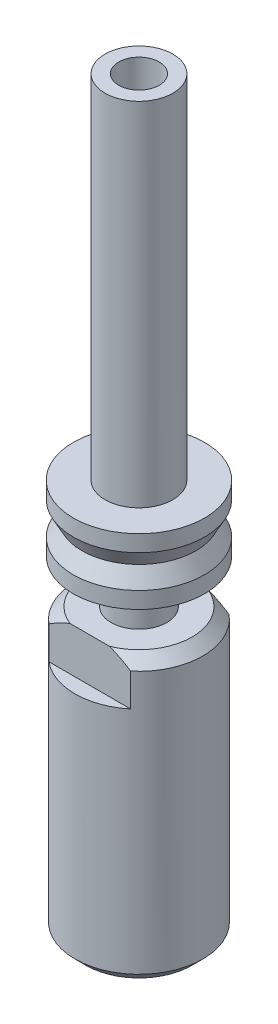
ISO-10303-21;
HEADER;
FILE_DESCRIPTION(('STEP AP214'),'2;1');
FILE_NAME('part.step','',(''),(''),'','','');
FILE_SCHEMA(('AUTOMOTIVE_DESIGN { 1 0 10303 214 1 1 1 1 }'));
ENDSEC;
DATA;
#1=APPLICATION_CONTEXT('core data for automotive mechanical design processes');
#2=APPLICATION_PROTOCOL_DEFINITION('international standard','automotive_design',2000,#1);
#3=PRODUCT_CONTEXT('',#1,'mechanical');
#4=PRODUCT('Part','Part','',(#3));
#5=PRODUCT_RELATED_PRODUCT_CATEGORY('part','',(#4));
#6=PRODUCT_DEFINITION_FORMATION('','',#4);
#7=PRODUCT_DEFINITION_CONTEXT('part definition',#1,'design');
#8=PRODUCT_DEFINITION('design','',#6,#7);
#9=PRODUCT_DEFINITION_SHAPE('','',#8);
#10=(LENGTH_UNIT() NAMED_UNIT(*) SI_UNIT(.MILLI.,.METRE.));
#11=(NAMED_UNIT(*) PLANE_ANGLE_UNIT() SI_UNIT($,.RADIAN.));
#12=(NAMED_UNIT(*) SI_UNIT($,.STERADIAN.) SOLID_ANGLE_UNIT());
#13=UNCERTAINTY_MEASURE_WITH_UNIT(LENGTH_MEASURE(1.E-05),#10,'distance_accuracy_value','');
#14=(GEOMETRIC_REPRESENTATION_CONTEXT(3) GLOBAL_UNCERTAINTY_ASSIGNED_CONTEXT((#13)) GLOBAL_UNIT_ASSIGNED_CONTEXT((#10,
#11,#12)) REPRESENTATION_CONTEXT('',''));
#15=CARTESIAN_POINT('',(0.,0.,0.));
#16=DIRECTION('',(0.,0.,1.));
#17=DIRECTION('',(1.,0.,0.));
#18=AXIS2_PLACEMENT_3D('',#15,#16,#17);
#19=CARTESIAN_POINT('',(0.,-2.,0.));
#20=DIRECTION('',(0.,-1.,0.));
#21=DIRECTION('',(0.,0.,-1.));
#22=AXIS2_PLACEMENT_3D('',#19,#20,#21);
#23=CONICAL_SURFACE('',#22,2.42500000000001,0.785398163397442);
#24=CARTESIAN_POINT('',(-6.04269539904228,-6.02299718405701,-2.25));
#25=CARTESIAN_POINT('',(-5.85392315526963,-5.84614321216174,-2.25));
#26=CARTESIAN_POINT('',(-5.6646934150476,-5.66977020501488,-2.25));
#27=CARTESIAN_POINT('',(-5.28485419184243,-5.31841346895825,-2.25));
#28=CARTESIAN_POINT('',(-5.09424434802556,-5.14343013045018,-2.25));
#29=CARTESIAN_POINT('',(-4.70961644395453,-4.79386269475751,-2.25));
#30=CARTESIAN_POINT('',(-4.51558315950188,-4.61929531450541,-2.25));
#31=CARTESIAN_POINT('',(-4.12509424635204,-4.27294806277855,-2.25));
#32=CARTESIAN_POINT('',(-3.92863904955637,-4.10116770659282,-2.25));
#33=CARTESIAN_POINT('',(-3.5659038288083,-3.79056325138715,-2.25));
#34=CARTESIAN_POINT('',(-3.40017145575118,-3.65110095413692,-2.25));
#35=CARTESIAN_POINT('',(-3.06525482429823,-3.3761915318433,-2.25));
#36=CARTESIAN_POINT('',(-2.89606908421042,-3.24074619415351,-2.25));
#37=CARTESIAN_POINT('',(-2.63883692782491,-3.04242343026941,-2.25));
#38=CARTESIAN_POINT('',(-2.55260958941985,-2.97718931723904,-2.25));
#39=CARTESIAN_POINT('',(-2.37868638950739,-2.8487136204099,-2.25));
#40=CARTESIAN_POINT('',(-2.29099063101107,-2.78547189773246,-2.25));
#41=CARTESIAN_POINT('',(-2.11387321277794,-2.66157705236619,-2.25));
#42=CARTESIAN_POINT('',(-2.02445280237287,-2.60092215103976,-2.25));
#43=CARTESIAN_POINT('',(-1.84345344982441,-2.48293820931975,-2.25));
#44=CARTESIAN_POINT('',(-1.75187497247355,-2.42560846181495,-2.25));
#45=CARTESIAN_POINT('',(-1.58428754294718,-2.32615581314897,-2.25));
#46=CARTESIAN_POINT('',(-1.50874290524784,-2.28325398598045,-2.25));
#47=CARTESIAN_POINT('',(-1.35568339080589,-2.20106302782308,-2.25));
#48=CARTESIAN_POINT('',(-1.27816825399849,-2.16177437689107,-2.25));
#49=CARTESIAN_POINT('',(-1.12104869321378,-2.08785717351091,-2.25));
#50=CARTESIAN_POINT('',(-1.04144710379408,-2.05322265424139,-2.25));
#51=CARTESIAN_POINT('',(-0.879934056748406,-1.98980356260767,-2.25));
#52=CARTESIAN_POINT('',(-0.798023312656502,-1.96101720522948,-2.25));
#53=CARTESIAN_POINT('',(-0.649993812839143,-1.91618679919093,-2.25));
#54=CARTESIAN_POINT('',(-0.584304280608316,-1.89873320313058,-2.25));
#55=CARTESIAN_POINT('',(-0.451770338017659,-1.86899899049763,-2.25));
#56=CARTESIAN_POINT('',(-0.384926328163733,-1.85671661603839,-2.25));
#57=CARTESIAN_POINT('',(-0.250597741822877,-1.8379385713068,-2.25));
#58=CARTESIAN_POINT('',(-0.183115309241266,-1.83142778506157,-2.25));
#59=CARTESIAN_POINT('',(-0.0478348246194907,-1.82449475801551,-2.25));
#60=CARTESIAN_POINT('',(0.0199632193035873,-1.82407236148567,-2.25));
#61=CARTESIAN_POINT('',(0.155341125798874,-1.82934096753563,-2.25));
#62=CARTESIAN_POINT('',(0.222920904057496,-1.83503410168034,-2.25));
#63=CARTESIAN_POINT('',(0.35734054863803,-1.85222314823185,-2.25));
#64=CARTESIAN_POINT('',(0.424180259835302,-1.8637202545225,-2.25));
#65=CARTESIAN_POINT('',(0.556924437810713,-1.89198993657772,-2.25));
#66=CARTESIAN_POINT('',(0.62282559921783,-1.90877783657871,-2.25));
#67=CARTESIAN_POINT('',(0.753271784597098,-1.94692551243794,-2.25));
#68=CARTESIAN_POINT('',(0.817816800607222,-1.96828531512992,-2.25));
#69=CARTESIAN_POINT('',(1.03626006799508,-2.04796499856611,-2.25));
#70=CARTESIAN_POINT('',(1.18673773108654,-2.11565951897345,-2.25));
#71=CARTESIAN_POINT('',(1.48043014893859,-2.26538094087567,-2.25));
#72=CARTESIAN_POINT('',(1.62362776930288,-2.34743980239225,-2.25));
#73=CARTESIAN_POINT('',(1.90614793057827,-2.52176605447454,-2.25));
#74=CARTESIAN_POINT('',(2.04539693537268,-2.61415117796364,-2.25));
#75=CARTESIAN_POINT('',(2.31942486505248,-2.80495316555597,-2.25));
#76=CARTESIAN_POINT('',(2.45420823425165,-2.90336373700816,-2.25));
#77=CARTESIAN_POINT('',(2.74471632171505,-3.12257720030645,-2.25));
#78=CARTESIAN_POINT('',(2.89981294242657,-3.24420772190934,-2.25));
#79=CARTESIAN_POINT('',(3.20685524548438,-3.49139682555347,-2.25));
#80=CARTESIAN_POINT('',(3.3588004776749,-3.6169559624334,-2.25));
#81=CARTESIAN_POINT('',(3.66050538618995,-3.87094873984889,-2.25));
#82=CARTESIAN_POINT('',(3.81026287636862,-3.9993849687665,-2.25));
#83=CARTESIAN_POINT('',(4.10802999251105,-4.25826906265923,-2.25));
#84=CARTESIAN_POINT('',(4.25603957808739,-4.38871697395673,-2.25));
#85=CARTESIAN_POINT('',(4.54192824844072,-4.64329805248578,-2.25));
#86=CARTESIAN_POINT('',(4.67988516731278,-4.76734397305246,-2.25));
#87=CARTESIAN_POINT('',(4.95485588810548,-5.01648107744459,-2.25));
#88=CARTESIAN_POINT('',(5.09186967137797,-5.14157228183026,-2.25));
#89=CARTESIAN_POINT('',(5.36487462829817,-5.39234186781037,-2.25));
#90=CARTESIAN_POINT('',(5.5008672577876,-5.5180186662129,-2.25));
#91=CARTESIAN_POINT('',(5.77222080994753,-5.77004191105563,-2.25));
#92=CARTESIAN_POINT('',(5.90758175737126,-5.89638833083443,-2.25));
#93=CARTESIAN_POINT('',(6.04269539904228,-6.02299718405701,-2.25));
#94=B_SPLINE_CURVE_WITH_KNOTS('',3,(#24,#25,#26,#27,#28,#29,#30,#31,#32,#33,#34,#35,#36,#37,#38,
#39,#40,#41,#42,#43,#44,#45,#46,#47,#48,#49,#50,#51,#52,#53,#54,#55,#56,#57,#58,#59,#60,#61,#62,
#63,#64,#65,#66,#67,#68,#69,#70,#71,#72,#73,#74,#75,#76,#77,#78,#79,#80,#81,#82,#83,#84,#85,#86,
#87,#88,#89,#90,#91,#92,#93),.UNSPECIFIED.,.F.,.F.,(4,2,2,2,2,2,2,2,2,2,2,2,2,2,2,2,2,2,2,2,2,2,
2,2,2,2,2,2,2,2,2,2,2,2,4),(0.,0.776029170871052,1.5522691443434,2.33526219012724,
3.11811756791359,3.76789020183039,4.41794774290245,4.74229638334316,5.06662236496042,
5.39072162894112,5.71475171690835,5.97530599165908,6.23589483452713,6.49614633593064,
6.75631828193723,6.96004621934655,7.16370484618176,7.36682849514538,7.569946948598,
7.77313622185684,7.9763673084277,8.18019252802659,8.38401894396392,8.8776117455327,
9.37231706156619,9.87338563818224,10.3739395680678,10.965144845378,11.5564339989266,
12.1482783575828,12.7401363648611,13.2967046712393,13.853283950933,14.4087973761007,
14.9642888468615),.UNSPECIFIED.);
#95=CARTESIAN_POINT('',(-1.86899036915675,-2.50000000000003,-2.25));
#96=VERTEX_POINT('',#95);
#97=CARTESIAN_POINT('',(-0.90450262575631,-2.,-2.25));
#98=VERTEX_POINT('',#97);
#99=EDGE_CURVE('E45',#96,#98,#94,.T.);
#100=ORIENTED_EDGE('',*,*,#99,.F.);
#101=CARTESIAN_POINT('',(0.,-2.5,0.));
#102=DIRECTION('',(0.,-1.,0.));
#103=DIRECTION('',(0.,0.,-1.));
#104=AXIS2_PLACEMENT_3D('',#101,#102,#103);
#105=CIRCLE('',#104,2.925);
#106=CARTESIAN_POINT('',(-1.86899036915657,-2.5,2.25));
#107=VERTEX_POINT('',#106);
#108=EDGE_CURVE('E302',#107,#96,#105,.T.);
#109=ORIENTED_EDGE('',*,*,#108,.F.);
#110=CARTESIAN_POINT('',(6.04269539904228,-6.02299718405701,2.25));
#111=CARTESIAN_POINT('',(5.85392315526963,-5.84614321216174,2.25));
#112=CARTESIAN_POINT('',(5.6646934150476,-5.66977020501488,2.25));
#113=CARTESIAN_POINT('',(5.28485419184243,-5.31841346895825,2.25));
#114=CARTESIAN_POINT('',(5.09424434802556,-5.14343013045018,2.25));
#115=CARTESIAN_POINT('',(4.70961644395453,-4.79386269475751,2.25));
#116=CARTESIAN_POINT('',(4.51558315950188,-4.61929531450541,2.25));
#117=CARTESIAN_POINT('',(4.12509424635204,-4.27294806277855,2.25));
#118=CARTESIAN_POINT('',(3.92863904955637,-4.10116770659282,2.25));
#119=CARTESIAN_POINT('',(3.5659038288083,-3.79056325138715,2.25));
#120=CARTESIAN_POINT('',(3.40017145575118,-3.65110095413692,2.25));
#121=CARTESIAN_POINT('',(3.06525482429823,-3.3761915318433,2.25));
#122=CARTESIAN_POINT('',(2.89606908421042,-3.24074619415351,2.25));
#123=CARTESIAN_POINT('',(2.63883692782492,-3.04242343026941,2.25));
#124=CARTESIAN_POINT('',(2.55260958941985,-2.97718931723904,2.25));
#125=CARTESIAN_POINT('',(2.3786863895074,-2.8487136204099,2.25));
#126=CARTESIAN_POINT('',(2.29099063101107,-2.78547189773246,2.25));
#127=CARTESIAN_POINT('',(2.11387321277795,-2.6615770523662,2.25));
#128=CARTESIAN_POINT('',(2.02445280237287,-2.60092215103976,2.25));
#129=CARTESIAN_POINT('',(1.84345344982442,-2.48293820931976,2.25));
#130=CARTESIAN_POINT('',(1.75187497247355,-2.42560846181495,2.25));
#131=CARTESIAN_POINT('',(1.58428754294718,-2.32615581314897,2.25));
#132=CARTESIAN_POINT('',(1.50874290524785,-2.28325398598045,2.25));
#133=CARTESIAN_POINT('',(1.35568339080589,-2.20106302782308,2.25));
#134=CARTESIAN_POINT('',(1.27816825399849,-2.16177437689107,2.25));
#135=CARTESIAN_POINT('',(1.12104869321378,-2.08785717351091,2.25));
#136=CARTESIAN_POINT('',(1.04144710379408,-2.0532226542414,2.25));
#137=CARTESIAN_POINT('',(0.879934056748408,-1.98980356260767,2.25));
#138=CARTESIAN_POINT('',(0.798023312656504,-1.96101720522948,2.25));
#139=CARTESIAN_POINT('',(0.649993812839145,-1.91618679919093,2.25));
#140=CARTESIAN_POINT('',(0.584304280608318,-1.89873320313058,2.25));
#141=CARTESIAN_POINT('',(0.451770338017662,-1.86899899049763,2.25));
#142=CARTESIAN_POINT('',(0.384926328163736,-1.85671661603839,2.25));
#143=CARTESIAN_POINT('',(0.25059774182288,-1.8379385713068,2.25));
#144=CARTESIAN_POINT('',(0.183115309241269,-1.83142778506157,2.25));
#145=CARTESIAN_POINT('',(0.0478348246194936,-1.82449475801551,2.25));
#146=CARTESIAN_POINT('',(-0.0199632193035848,-1.82407236148567,2.25));
#147=CARTESIAN_POINT('',(-0.155341125798872,-1.82934096753563,2.25));
#148=CARTESIAN_POINT('',(-0.222920904057495,-1.83503410168034,2.25));
#149=CARTESIAN_POINT('',(-0.357340548638028,-1.85222314823185,2.25));
#150=CARTESIAN_POINT('',(-0.4241802598353,-1.8637202545225,2.25));
#151=CARTESIAN_POINT('',(-0.556924437810711,-1.89198993657772,2.25));
#152=CARTESIAN_POINT('',(-0.622825599217827,-1.90877783657871,2.25));
#153=CARTESIAN_POINT('',(-0.753271784597096,-1.94692551243794,2.25));
#154=CARTESIAN_POINT('',(-0.81781680060722,-1.96828531512992,2.25));
#155=CARTESIAN_POINT('',(-1.03626006799508,-2.04796499856611,2.25));
#156=CARTESIAN_POINT('',(-1.18673773108653,-2.11565951897345,2.25));
#157=CARTESIAN_POINT('',(-1.48043014893859,-2.26538094087566,2.25));
#158=CARTESIAN_POINT('',(-1.62362776930288,-2.34743980239224,2.25));
#159=CARTESIAN_POINT('',(-1.90614793057826,-2.52176605447454,2.25));
#160=CARTESIAN_POINT('',(-2.04539693537268,-2.61415117796364,2.25));
#161=CARTESIAN_POINT('',(-2.31942486505247,-2.80495316555596,2.25));
#162=CARTESIAN_POINT('',(-2.45420823425165,-2.90336373700815,2.25));
#163=CARTESIAN_POINT('',(-2.74471632171505,-3.12257720030645,2.25));
#164=CARTESIAN_POINT('',(-2.89981294242656,-3.24420772190933,2.25));
#165=CARTESIAN_POINT('',(-3.20685524548438,-3.49139682555347,2.25));
#166=CARTESIAN_POINT('',(-3.35880047767489,-3.61695596243339,2.25));
#167=CARTESIAN_POINT('',(-3.66050538618995,-3.87094873984888,2.25));
#168=CARTESIAN_POINT('',(-3.81026287636861,-3.99938496876649,2.25));
#169=CARTESIAN_POINT('',(-4.10802999251105,-4.25826906265923,2.25));
#170=CARTESIAN_POINT('',(-4.25603957808739,-4.38871697395673,2.25));
#171=CARTESIAN_POINT('',(-4.54192824844071,-4.64329805248577,2.25));
#172=CARTESIAN_POINT('',(-4.67988516731278,-4.76734397305246,2.25));
#173=CARTESIAN_POINT('',(-4.95485588810548,-5.01648107744459,2.25));
#174=CARTESIAN_POINT('',(-5.09186967137797,-5.14157228183026,2.25));
#175=CARTESIAN_POINT('',(-5.36487462829817,-5.39234186781037,2.25));
#176=CARTESIAN_POINT('',(-5.5008672577876,-5.5180186662129,2.25));
#177=CARTESIAN_POINT('',(-5.77222080994753,-5.77004191105563,2.25));
#178=CARTESIAN_POINT('',(-5.90758175737126,-5.89638833083443,2.25));
#179=CARTESIAN_POINT('',(-6.04269539904228,-6.02299718405701,2.25));
#180=B_SPLINE_CURVE_WITH_KNOTS('',3,(#110,#111,#112,#113,#114,#115,#116,#117,#118,#119,#120,
#121,#122,#123,#124,#125,#126,#127,#128,#129,#130,#131,#132,#133,#134,#135,#136,#137,#138,#139,
#140,#141,#142,#143,#144,#145,#146,#147,#148,#149,#150,#151,#152,#153,#154,#155,#156,#157,#158,
#159,#160,#161,#162,#163,#164,#165,#166,#167,#168,#169,#170,#171,#172,#173,#174,#175,#176,#177,
#178,#179),.UNSPECIFIED.,.F.,.F.,(4,2,2,2,2,2,2,2,2,2,2,2,2,2,2,2,2,2,2,2,2,2,2,2,2,2,2,2,2,2,2,
2,2,2,4),(0.,0.776029170871053,1.5522691443434,2.33526219012724,3.11811756791359,
3.76789020183039,4.41794774290245,4.74229638334315,5.06662236496042,5.39072162894112,
5.71475171690834,5.97530599165908,6.23589483452712,6.49614633593064,6.75631828193722,
6.96004621934654,7.16370484618176,7.36682849514538,7.569946948598,7.77313622185684,
7.9763673084277,8.18019252802659,8.38401894396391,8.87761174553269,9.37231706156618,
9.87338563818223,10.3739395680678,10.965144845378,11.5564339989266,12.1482783575828,
12.7401363648611,13.2967046712393,13.853283950933,14.4087973761007,14.9642888468615),.UNSPECIFIED.);
#181=CARTESIAN_POINT('',(-0.90450262575631,-2.,2.25));
#182=VERTEX_POINT('',#181);
#183=EDGE_CURVE('E107',#182,#107,#180,.T.);
#184=ORIENTED_EDGE('',*,*,#183,.F.);
#185=CARTESIAN_POINT('',(0.,-2.,0.));
#186=DIRECTION('',(0.,-1.,0.));
#187=DIRECTION('',(0.,0.,-1.));
#188=AXIS2_PLACEMENT_3D('',#185,#186,#187);
#189=CIRCLE('',#188,2.42500000000001);
#190=EDGE_CURVE('E59',#98,#182,#189,.F.);
#191=ORIENTED_EDGE('',*,*,#190,.F.);
#192=EDGE_LOOP('',(#100,#109,#184,#191));
#193=FACE_BOUND('',#192,.T.);
#194=ADVANCED_FACE('F35',(#193),#23,.T.);
#195=CARTESIAN_POINT('',(0.,26.0943396226415,0.));
#196=DIRECTION('',(0.,1.,0.));
#197=DIRECTION('',(0.,0.,1.));
#198=AXIS2_PLACEMENT_3D('',#195,#196,#197);
#199=CYLINDRICAL_SURFACE('',#198,0.925000000000003);
#200=CARTESIAN_POINT('',(0.,19.1,0.));
#201=DIRECTION('',(0.,-1.,0.));
#202=DIRECTION('',(0.,0.,-1.));
#203=AXIS2_PLACEMENT_3D('',#200,#201,#202);
#204=CIRCLE('',#203,0.925000000000003);
#205=CARTESIAN_POINT('',(0.,19.1,-0.925000000000003));
#206=VERTEX_POINT('',#205);
#207=EDGE_CURVE('E104',#206,#206,#204,.F.);
#208=ORIENTED_EDGE('',*,*,#207,.T.);
#209=EDGE_LOOP('',(#208));
#210=FACE_BOUND('',#209,.T.);
#211=CARTESIAN_POINT('',(0.,-15.,0.));
#212=DIRECTION('',(0.,1.,0.));
#213=DIRECTION('',(0.,0.,1.));
#214=AXIS2_PLACEMENT_3D('',#211,#212,#213);
#215=CIRCLE('',#214,0.925000000000005);
#216=CARTESIAN_POINT('',(0.,-15.,0.925000000000005));
#217=VERTEX_POINT('',#216);
#218=EDGE_CURVE('E340',#217,#217,#215,.T.);
#219=ORIENTED_EDGE('',*,*,#218,.F.);
#220=EDGE_LOOP('',(#219));
#221=FACE_BOUND('',#220,.T.);
#222=ADVANCED_FACE('F177',(#210,#221),#199,.F.);
#223=CARTESIAN_POINT('',(0.,-15.,-0.925000000000005));
#224=DIRECTION('',(0.,1.,0.));
#225=DIRECTION('',(0.,0.,1.));
#226=AXIS2_PLACEMENT_3D('',#223,#224,#225);
#227=PLANE('',#226);
#228=CARTESIAN_POINT('',(0.,-15.,0.));
#229=DIRECTION('',(0.,1.,0.));
#230=DIRECTION('',(0.,0.,1.));
#231=AXIS2_PLACEMENT_3D('',#228,#229,#230);
#232=CIRCLE('',#231,2.425);
#233=CARTESIAN_POINT('',(0.,-15.,2.425));
#234=VERTEX_POINT('',#233);
#235=EDGE_CURVE('E108',#234,#234,#232,.F.);
#236=ORIENTED_EDGE('',*,*,#235,.T.);
#237=EDGE_LOOP('',(#236));
#238=FACE_BOUND('',#237,.T.);
#239=ORIENTED_EDGE('',*,*,#218,.T.);
#240=EDGE_LOOP('',(#239));
#241=FACE_BOUND('',#240,.T.);
#242=ADVANCED_FACE('F173',(#238,#241),#227,.F.);
#243=CARTESIAN_POINT('',(0.,26.0943396226415,0.));
#244=DIRECTION('',(0.,1.,0.));
#245=DIRECTION('',(0.,0.,1.));
#246=AXIS2_PLACEMENT_3D('',#243,#244,#245);
#247=CYLINDRICAL_SURFACE('',#246,2.925);
#248=CARTESIAN_POINT('',(0.,-14.5,0.));
#249=DIRECTION('',(0.,1.,0.));
#250=DIRECTION('',(0.,0.,1.));
#251=AXIS2_PLACEMENT_3D('',#248,#249,#250);
#252=CIRCLE('',#251,2.925);
#253=CARTESIAN_POINT('',(0.,-14.5,2.925));
#254=VERTEX_POINT('',#253);
#255=EDGE_CURVE('E111',#254,#254,#252,.T.);
#256=ORIENTED_EDGE('',*,*,#255,.T.);
#257=EDGE_LOOP('',(#256));
#258=FACE_BOUND('',#257,.T.);
#259=CARTESIAN_POINT('',(0.,-4.,0.));
#260=DIRECTION('',(0.,-1.,0.));
#261=DIRECTION('',(0.,0.,-1.));
#262=AXIS2_PLACEMENT_3D('',#259,#260,#261);
#263=CIRCLE('',#262,2.925);
#264=CARTESIAN_POINT('',(-1.86899036915656,-4.,-2.25));
#265=VERTEX_POINT('',#264);
#266=CARTESIAN_POINT('',(1.86899036915656,-4.,-2.25));
#267=VERTEX_POINT('',#266);
#268=EDGE_CURVE('E11',#265,#267,#263,.T.);
#269=ORIENTED_EDGE('',*,*,#268,.T.);
#270=DIRECTION('',(0.,1.,0.));
#271=VECTOR('',#270,1.);
#272=CARTESIAN_POINT('',(1.86899036915656,26.0943396226415,-2.25000000000001));
#273=LINE('',#272,#271);
#274=CARTESIAN_POINT('',(1.86899036915657,-2.5,-2.25));
#275=VERTEX_POINT('',#274);
#276=EDGE_CURVE('E296',#267,#275,#273,.T.);
#277=ORIENTED_EDGE('',*,*,#276,.T.);
#278=CARTESIAN_POINT('',(1.86899036915675,-2.50000000000003,2.25));
#279=VERTEX_POINT('',#278);
#280=EDGE_CURVE('E343',#275,#279,#105,.T.);
#281=ORIENTED_EDGE('',*,*,#280,.T.);
#282=DIRECTION('',(0.,1.,0.));
#283=VECTOR('',#282,1.);
#284=CARTESIAN_POINT('',(1.86899036915656,26.0943396226415,2.25000000000001));
#285=LINE('',#284,#283);
#286=CARTESIAN_POINT('',(1.86899036915658,-4.,2.25));
#287=VERTEX_POINT('',#286);
#288=EDGE_CURVE('E313',#279,#287,#285,.F.);
#289=ORIENTED_EDGE('',*,*,#288,.T.);
#290=CARTESIAN_POINT('',(0.,-4.,0.));
#291=DIRECTION('',(0.,-1.,0.));
#292=DIRECTION('',(0.,0.,-1.));
#293=AXIS2_PLACEMENT_3D('',#290,#291,#292);
#294=CIRCLE('',#293,2.925);
#295=CARTESIAN_POINT('',(-1.86899036915658,-4.,2.25));
#296=VERTEX_POINT('',#295);
#297=EDGE_CURVE('E121',#287,#296,#294,.T.);
#298=ORIENTED_EDGE('',*,*,#297,.T.);
#299=DIRECTION('',(0.,1.,0.));
#300=VECTOR('',#299,1.);
#301=CARTESIAN_POINT('',(-1.86899036915656,26.0943396226415,2.25000000000001));
#302=LINE('',#301,#300);
#303=EDGE_CURVE('E310',#296,#107,#302,.T.);
#304=ORIENTED_EDGE('',*,*,#303,.T.);
#305=ORIENTED_EDGE('',*,*,#108,.T.);
#306=DIRECTION('',(0.,1.,0.));
#307=VECTOR('',#306,1.);
#308=CARTESIAN_POINT('',(-1.86899036915656,26.0943396226415,-2.25000000000001));
#309=LINE('',#308,#307);
#310=EDGE_CURVE('E92',#96,#265,#309,.F.);
#311=ORIENTED_EDGE('',*,*,#310,.T.);
#312=EDGE_LOOP('',(#269,#277,#281,#289,#298,#304,#305,#311));
#313=FACE_BOUND('',#312,.T.);
#314=ADVANCED_FACE('F170',(#258,#313),#247,.T.);
#315=CARTESIAN_POINT('',(0.,-2.,-2.925));
#316=DIRECTION('',(0.,-1.,0.));
#317=DIRECTION('',(0.,0.,-1.));
#318=AXIS2_PLACEMENT_3D('',#315,#316,#317);
#319=PLANE('',#318);
#320=CARTESIAN_POINT('',(0.90450262575631,-2.,2.25));
#321=VERTEX_POINT('',#320);
#322=CARTESIAN_POINT('',(0.90450262575631,-2.,-2.25));
#323=VERTEX_POINT('',#322);
#324=EDGE_CURVE('E102',#321,#323,#189,.F.);
#325=ORIENTED_EDGE('',*,*,#324,.T.);
#326=DIRECTION('',(1.,0.,0.));
#327=VECTOR('',#326,1.);
#328=CARTESIAN_POINT('',(-3.,-2.,-2.25));
#329=LINE('',#328,#327);
#330=EDGE_CURVE('E52',#98,#323,#329,.T.);
#331=ORIENTED_EDGE('',*,*,#330,.F.);
#332=ORIENTED_EDGE('',*,*,#190,.T.);
#333=DIRECTION('',(1.,0.,0.));
#334=VECTOR('',#333,1.);
#335=CARTESIAN_POINT('',(-3.,-2.,2.25));
#336=LINE('',#335,#334);
#337=EDGE_CURVE('E306',#182,#321,#336,.T.);
#338=ORIENTED_EDGE('',*,*,#337,.T.);
#339=EDGE_LOOP('',(#325,#331,#332,#338));
#340=FACE_BOUND('',#339,.T.);
#341=CARTESIAN_POINT('',(0.,-2.,0.));
#342=DIRECTION('',(0.,1.,0.));
#343=DIRECTION('',(0.,0.,1.));
#344=AXIS2_PLACEMENT_3D('',#341,#342,#343);
#345=CIRCLE('',#344,1.275);
#346=CARTESIAN_POINT('',(0.,-2.,1.275));
#347=VERTEX_POINT('',#346);
#348=EDGE_CURVE('E337',#347,#347,#345,.T.);
#349=ORIENTED_EDGE('',*,*,#348,.F.);
#350=EDGE_LOOP('',(#349));
#351=FACE_BOUND('',#350,.T.);
#352=ADVANCED_FACE('F99',(#340,#351),#319,.F.);
#353=CARTESIAN_POINT('',(0.,26.0943396226415,0.));
#354=DIRECTION('',(0.,1.,0.));
#355=DIRECTION('',(0.,0.,1.));
#356=AXIS2_PLACEMENT_3D('',#353,#354,#355);
#357=CYLINDRICAL_SURFACE('',#356,1.275);
#358=CARTESIAN_POINT('',(0.,0.,0.));
#359=DIRECTION('',(0.,1.,0.));
#360=DIRECTION('',(0.,0.,1.));
#361=AXIS2_PLACEMENT_3D('',#358,#359,#360);
#362=CIRCLE('',#361,1.275);
#363=CARTESIAN_POINT('',(0.,0.,1.275));
#364=VERTEX_POINT('',#363);
#365=EDGE_CURVE('E334',#364,#364,#362,.T.);
#366=ORIENTED_EDGE('',*,*,#365,.F.);
#367=EDGE_LOOP('',(#366));
#368=FACE_BOUND('',#367,.T.);
#369=ORIENTED_EDGE('',*,*,#348,.T.);
#370=EDGE_LOOP('',(#369));
#371=FACE_BOUND('',#370,.T.);
#372=ADVANCED_FACE('F163',(#368,#371),#357,.T.);
#373=CARTESIAN_POINT('',(0.,0.,-1.275));
#374=DIRECTION('',(0.,1.,0.));
#375=DIRECTION('',(0.,0.,1.));
#376=AXIS2_PLACEMENT_3D('',#373,#374,#375);
#377=PLANE('',#376);
#378=CARTESIAN_POINT('',(0.,0.,0.));
#379=DIRECTION('',(0.,1.,0.));
#380=DIRECTION('',(0.,0.,1.));
#381=AXIS2_PLACEMENT_3D('',#378,#379,#380);
#382=CIRCLE('',#381,3.);
#383=CARTESIAN_POINT('',(0.,0.,3.));
#384=VERTEX_POINT('',#383);
#385=EDGE_CURVE('E331',#384,#384,#382,.T.);
#386=ORIENTED_EDGE('',*,*,#385,.F.);
#387=EDGE_LOOP('',(#386));
#388=FACE_BOUND('',#387,.T.);
#389=ORIENTED_EDGE('',*,*,#365,.T.);
#390=EDGE_LOOP('',(#389));
#391=FACE_BOUND('',#390,.T.);
#392=ADVANCED_FACE('F159',(#388,#391),#377,.F.);
#393=CARTESIAN_POINT('',(0.,26.0943396226415,0.));
#394=DIRECTION('',(0.,1.,0.));
#395=DIRECTION('',(0.,0.,1.));
#396=AXIS2_PLACEMENT_3D('',#393,#394,#395);
#397=CYLINDRICAL_SURFACE('',#396,3.);
#398=CARTESIAN_POINT('',(0.,0.753,0.));
#399=DIRECTION('',(0.,1.,0.));
#400=DIRECTION('',(0.,0.,1.));
#401=AXIS2_PLACEMENT_3D('',#398,#399,#400);
#402=CIRCLE('',#401,3.);
#403=CARTESIAN_POINT('',(0.,0.753,3.));
#404=VERTEX_POINT('',#403);
#405=EDGE_CURVE('E328',#404,#404,#402,.T.);
#406=ORIENTED_EDGE('',*,*,#405,.F.);
#407=EDGE_LOOP('',(#406));
#408=FACE_BOUND('',#407,.T.);
#409=ORIENTED_EDGE('',*,*,#385,.T.);
#410=EDGE_LOOP('',(#409));
#411=FACE_BOUND('',#410,.T.);
#412=ADVANCED_FACE('F155',(#408,#411),#397,.T.);
#413=CARTESIAN_POINT('',(0.,0.753,0.));
#414=DIRECTION('',(0.,-1.,0.));
#415=DIRECTION('',(0.,0.,-1.));
#416=AXIS2_PLACEMENT_3D('',#413,#414,#415);
#417=CONICAL_SURFACE('',#416,3.,0.491623412875959);
#418=CARTESIAN_POINT('',(0.,1.5,0.));
#419=DIRECTION('',(0.,1.,0.));
#420=DIRECTION('',(0.,0.,1.));
#421=AXIS2_PLACEMENT_3D('',#418,#419,#420);
#422=CIRCLE('',#421,2.6);
#423=CARTESIAN_POINT('',(0.,1.5,2.6));
#424=VERTEX_POINT('',#423);
#425=EDGE_CURVE('E325',#424,#424,#422,.T.);
#426=ORIENTED_EDGE('',*,*,#425,.F.);
#427=EDGE_LOOP('',(#426));
#428=FACE_BOUND('',#427,.T.);
#429=ORIENTED_EDGE('',*,*,#405,.T.);
#430=EDGE_LOOP('',(#429));
#431=FACE_BOUND('',#430,.T.);
#432=ADVANCED_FACE('F151',(#428,#431),#417,.T.);
#433=CARTESIAN_POINT('',(0.,1.5,0.));
#434=DIRECTION('',(0.,1.,0.));
#435=DIRECTION('',(0.,0.,1.));
#436=AXIS2_PLACEMENT_3D('',#433,#434,#435);
#437=CONICAL_SURFACE('',#436,2.6,0.491623412875959);
#438=CARTESIAN_POINT('',(0.,2.247,0.));
#439=DIRECTION('',(0.,1.,0.));
#440=DIRECTION('',(0.,0.,1.));
#441=AXIS2_PLACEMENT_3D('',#438,#439,#440);
#442=CIRCLE('',#441,3.);
#443=CARTESIAN_POINT('',(0.,2.247,3.));
#444=VERTEX_POINT('',#443);
#445=EDGE_CURVE('E322',#444,#444,#442,.T.);
#446=ORIENTED_EDGE('',*,*,#445,.F.);
#447=EDGE_LOOP('',(#446));
#448=FACE_BOUND('',#447,.T.);
#449=ORIENTED_EDGE('',*,*,#425,.T.);
#450=EDGE_LOOP('',(#449));
#451=FACE_BOUND('',#450,.T.);
#452=ADVANCED_FACE('F147',(#448,#451),#437,.T.);
#453=CARTESIAN_POINT('',(0.,26.0943396226415,0.));
#454=DIRECTION('',(0.,1.,0.));
#455=DIRECTION('',(0.,0.,1.));
#456=AXIS2_PLACEMENT_3D('',#453,#454,#455);
#457=CYLINDRICAL_SURFACE('',#456,3.);
#458=CARTESIAN_POINT('',(0.,3.,0.));
#459=DIRECTION('',(0.,1.,0.));
#460=DIRECTION('',(0.,0.,1.));
#461=AXIS2_PLACEMENT_3D('',#458,#459,#460);
#462=CIRCLE('',#461,3.);
#463=CARTESIAN_POINT('',(0.,3.,3.));
#464=VERTEX_POINT('',#463);
#465=EDGE_CURVE('E319',#464,#464,#462,.T.);
#466=ORIENTED_EDGE('',*,*,#465,.F.);
#467=EDGE_LOOP('',(#466));
#468=FACE_BOUND('',#467,.T.);
#469=ORIENTED_EDGE('',*,*,#445,.T.);
#470=EDGE_LOOP('',(#469));
#471=FACE_BOUND('',#470,.T.);
#472=ADVANCED_FACE('F143',(#468,#471),#457,.T.);
#473=CARTESIAN_POINT('',(0.,3.,-3.));
#474=DIRECTION('',(0.,-1.,0.));
#475=DIRECTION('',(0.,0.,-1.));
#476=AXIS2_PLACEMENT_3D('',#473,#474,#475);
#477=PLANE('',#476);
#478=CARTESIAN_POINT('',(0.,3.,0.));
#479=DIRECTION('',(0.,1.,0.));
#480=DIRECTION('',(0.,0.,1.));
#481=AXIS2_PLACEMENT_3D('',#478,#479,#480);
#482=CIRCLE('',#481,1.55);
#483=CARTESIAN_POINT('',(0.,3.,1.55));
#484=VERTEX_POINT('',#483);
#485=EDGE_CURVE('E316',#484,#484,#482,.T.);
#486=ORIENTED_EDGE('',*,*,#485,.F.);
#487=EDGE_LOOP('',(#486));
#488=FACE_BOUND('',#487,.T.);
#489=ORIENTED_EDGE('',*,*,#465,.T.);
#490=EDGE_LOOP('',(#489));
#491=FACE_BOUND('',#490,.T.);
#492=ADVANCED_FACE('F139',(#488,#491),#477,.F.);
#493=CARTESIAN_POINT('',(0.,26.0943396226415,0.));
#494=DIRECTION('',(0.,1.,0.));
#495=DIRECTION('',(0.,0.,1.));
#496=AXIS2_PLACEMENT_3D('',#493,#494,#495);
#497=CYLINDRICAL_SURFACE('',#496,1.55);
#498=CARTESIAN_POINT('',(0.,19.1,0.));
#499=DIRECTION('',(0.,-1.,0.));
#500=DIRECTION('',(0.,0.,-1.));
#501=AXIS2_PLACEMENT_3D('',#498,#499,#500);
#502=CIRCLE('',#501,1.55);
#503=CARTESIAN_POINT('',(0.,19.1,-1.55));
#504=VERTEX_POINT('',#503);
#505=EDGE_CURVE('E40',#504,#504,#502,.T.);
#506=ORIENTED_EDGE('',*,*,#505,.T.);
#507=EDGE_LOOP('',(#506));
#508=FACE_BOUND('',#507,.T.);
#509=ORIENTED_EDGE('',*,*,#485,.T.);
#510=EDGE_LOOP('',(#509));
#511=FACE_BOUND('',#510,.T.);
#512=ADVANCED_FACE('F135',(#508,#511),#497,.T.);
#513=CARTESIAN_POINT('',(0.,-14.5,0.));
#514=DIRECTION('',(0.,1.,0.));
#515=DIRECTION('',(0.,0.,1.));
#516=AXIS2_PLACEMENT_3D('',#513,#514,#515);
#517=CONICAL_SURFACE('',#516,2.925,0.785398163397453);
#518=ORIENTED_EDGE('',*,*,#235,.F.);
#519=EDGE_LOOP('',(#518));
#520=FACE_BOUND('',#519,.T.);
#521=ORIENTED_EDGE('',*,*,#255,.F.);
#522=EDGE_LOOP('',(#521));
#523=FACE_BOUND('',#522,.T.);
#524=ADVANCED_FACE('F138',(#520,#523),#517,.T.);
#525=EDGE_CURVE('E96',#323,#275,#94,.T.);
#526=ORIENTED_EDGE('',*,*,#525,.F.);
#527=ORIENTED_EDGE('',*,*,#324,.F.);
#528=EDGE_CURVE('E120',#279,#321,#180,.T.);
#529=ORIENTED_EDGE('',*,*,#528,.F.);
#530=ORIENTED_EDGE('',*,*,#280,.F.);
#531=EDGE_LOOP('',(#526,#527,#529,#530));
#532=FACE_BOUND('',#531,.T.);
#533=ADVANCED_FACE('F37',(#532),#23,.T.);
#534=CARTESIAN_POINT('',(-3.,-4.,4.25));
#535=DIRECTION('',(0.,-1.,0.));
#536=DIRECTION('',(0.,0.,-1.));
#537=AXIS2_PLACEMENT_3D('',#534,#535,#536);
#538=PLANE('',#537);
#539=DIRECTION('',(1.,0.,0.));
#540=VECTOR('',#539,1.);
#541=CARTESIAN_POINT('',(-3.,-4.,2.25));
#542=LINE('',#541,#540);
#543=EDGE_CURVE('E303',#296,#287,#542,.T.);
#544=ORIENTED_EDGE('',*,*,#543,.F.);
#545=ORIENTED_EDGE('',*,*,#297,.F.);
#546=EDGE_LOOP('',(#544,#545));
#547=FACE_BOUND('',#546,.T.);
#548=ADVANCED_FACE('F128',(#547),#538,.F.);
#549=CARTESIAN_POINT('',(-3.,-2.,2.25));
#550=DIRECTION('',(0.,0.,-1.));
#551=DIRECTION('',(0.,1.,0.));
#552=AXIS2_PLACEMENT_3D('',#549,#550,#551);
#553=PLANE('',#552);
#554=ORIENTED_EDGE('',*,*,#528,.T.);
#555=ORIENTED_EDGE('',*,*,#337,.F.);
#556=ORIENTED_EDGE('',*,*,#183,.T.);
#557=ORIENTED_EDGE('',*,*,#303,.F.);
#558=ORIENTED_EDGE('',*,*,#543,.T.);
#559=ORIENTED_EDGE('',*,*,#288,.F.);
#560=EDGE_LOOP('',(#554,#555,#556,#557,#558,#559));
#561=FACE_BOUND('',#560,.T.);
#562=ADVANCED_FACE('F122',(#561),#553,.F.);
#563=CARTESIAN_POINT('',(-3.,-4.,-4.25));
#564=DIRECTION('',(0.,-1.,0.));
#565=DIRECTION('',(0.,0.,-1.));
#566=AXIS2_PLACEMENT_3D('',#563,#564,#565);
#567=PLANE('',#566);
#568=DIRECTION('',(1.,0.,0.));
#569=VECTOR('',#568,1.);
#570=CARTESIAN_POINT('',(-3.,-4.,-2.25));
#571=LINE('',#570,#569);
#572=EDGE_CURVE('E103',#265,#267,#571,.T.);
#573=ORIENTED_EDGE('',*,*,#572,.T.);
#574=ORIENTED_EDGE('',*,*,#268,.F.);
#575=EDGE_LOOP('',(#573,#574));
#576=FACE_BOUND('',#575,.T.);
#577=ADVANCED_FACE('F127',(#576),#567,.F.);
#578=CARTESIAN_POINT('',(-3.,-2.,-2.25));
#579=DIRECTION('',(0.,0.,1.));
#580=DIRECTION('',(0.,-1.,0.));
#581=AXIS2_PLACEMENT_3D('',#578,#579,#580);
#582=PLANE('',#581);
#583=ORIENTED_EDGE('',*,*,#99,.T.);
#584=ORIENTED_EDGE('',*,*,#330,.T.);
#585=ORIENTED_EDGE('',*,*,#525,.T.);
#586=ORIENTED_EDGE('',*,*,#276,.F.);
#587=ORIENTED_EDGE('',*,*,#572,.F.);
#588=ORIENTED_EDGE('',*,*,#310,.F.);
#589=EDGE_LOOP('',(#583,#584,#585,#586,#587,#588));
#590=FACE_BOUND('',#589,.T.);
#591=ADVANCED_FACE('F89',(#590),#582,.F.);
#592=CARTESIAN_POINT('',(-3.,19.1,3.));
#593=DIRECTION('',(0.,-1.,0.));
#594=DIRECTION('',(0.,0.,-1.));
#595=AXIS2_PLACEMENT_3D('',#592,#593,#594);
#596=PLANE('',#595);
#597=ORIENTED_EDGE('',*,*,#505,.F.);
#598=EDGE_LOOP('',(#597));
#599=FACE_BOUND('',#598,.T.);
#600=ORIENTED_EDGE('',*,*,#207,.F.);
#601=EDGE_LOOP('',(#600));
#602=FACE_BOUND('',#601,.T.);
#603=ADVANCED_FACE('F250',(#599,#602),#596,.F.);
#604=CLOSED_SHELL('',(#194,#222,#242,#314,#352,#372,#392,#412,#432,#452,#472,#492,#512,#524,
#533,#548,#562,#577,#591,#603));
#605=MANIFOLD_SOLID_BREP('B2',#604);
#606=ADVANCED_BREP_SHAPE_REPRESENTATION('',(#18,#605),#14);
#607=SHAPE_DEFINITION_REPRESENTATION(#9,#606);
ENDSEC;
END-ISO-10303-21;
